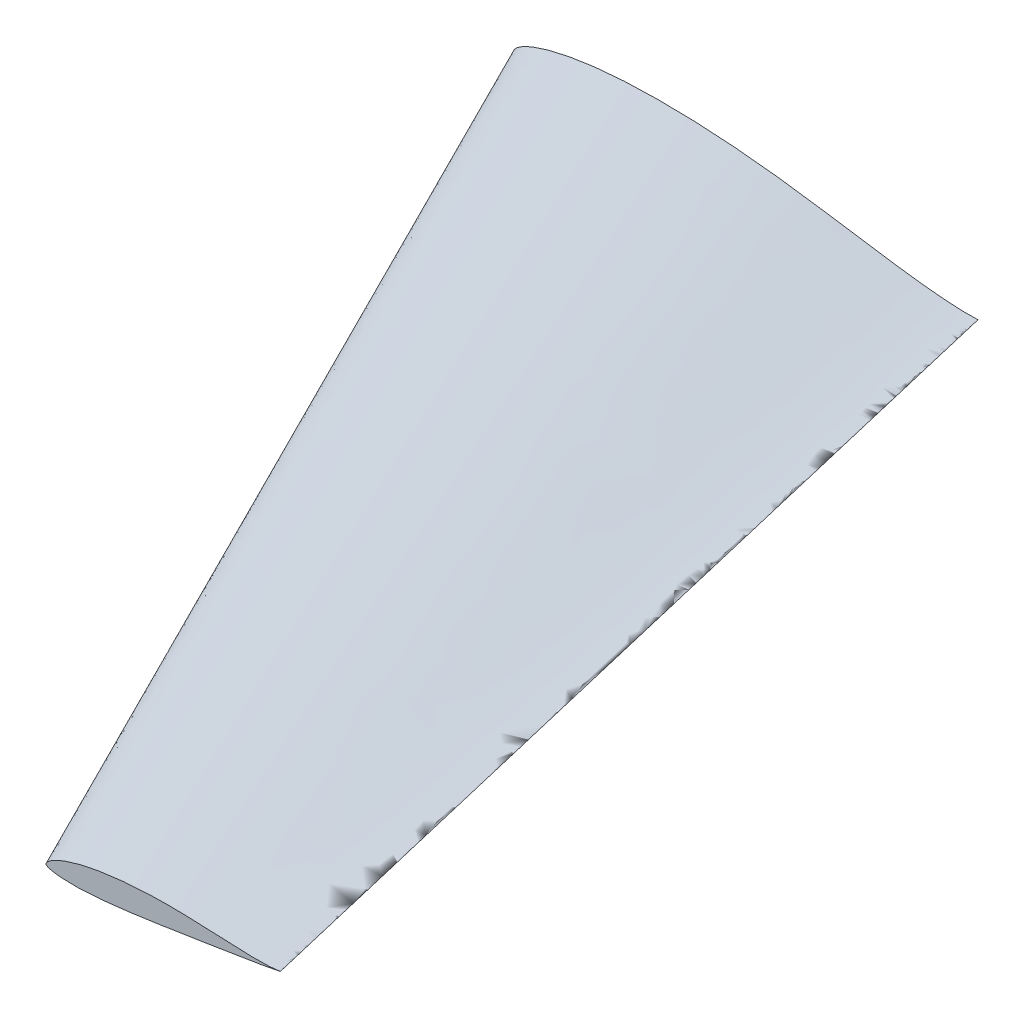
ISO-10303-21;
HEADER;
FILE_DESCRIPTION(('STEP AP214'),'2;1');
FILE_NAME('part.step','',(''),(''),'','','');
FILE_SCHEMA(('AUTOMOTIVE_DESIGN { 1 0 10303 214 1 1 1 1 }'));
ENDSEC;
DATA;
#1=APPLICATION_CONTEXT('core data for automotive mechanical design processes');
#2=APPLICATION_PROTOCOL_DEFINITION('international standard','automotive_design',2000,#1);
#3=PRODUCT_CONTEXT('',#1,'mechanical');
#4=PRODUCT('Part','Part','',(#3));
#5=PRODUCT_RELATED_PRODUCT_CATEGORY('part','',(#4));
#6=PRODUCT_DEFINITION_FORMATION('','',#4);
#7=PRODUCT_DEFINITION_CONTEXT('part definition',#1,'design');
#8=PRODUCT_DEFINITION('design','',#6,#7);
#9=PRODUCT_DEFINITION_SHAPE('','',#8);
#10=(LENGTH_UNIT() NAMED_UNIT(*) SI_UNIT(.MILLI.,.METRE.));
#11=(NAMED_UNIT(*) PLANE_ANGLE_UNIT() SI_UNIT($,.RADIAN.));
#12=(NAMED_UNIT(*) SI_UNIT($,.STERADIAN.) SOLID_ANGLE_UNIT());
#13=UNCERTAINTY_MEASURE_WITH_UNIT(LENGTH_MEASURE(1.E-05),#10,'distance_accuracy_value','');
#14=(GEOMETRIC_REPRESENTATION_CONTEXT(3) GLOBAL_UNCERTAINTY_ASSIGNED_CONTEXT((#13)) GLOBAL_UNIT_ASSIGNED_CONTEXT((#10,
#11,#12)) REPRESENTATION_CONTEXT('',''));
#15=CARTESIAN_POINT('',(0.,0.,0.));
#16=DIRECTION('',(0.,0.,1.));
#17=DIRECTION('',(1.,0.,0.));
#18=AXIS2_PLACEMENT_3D('',#15,#16,#17);
#19=CARTESIAN_POINT('',(-9.78695783442528,0.49823393795302,0.));
#20=DIRECTION('',(0.,0.,-1.));
#21=DIRECTION('',(-1.,0.,0.));
#22=AXIS2_PLACEMENT_3D('',#19,#20,#21);
#23=PLANE('',#22);
#24=CARTESIAN_POINT('',(90.,0.,0.));
#25=CARTESIAN_POINT('',(90.0028479732241,0.00436190831534167,0.));
#26=CARTESIAN_POINT('',(89.2649387295325,-0.0543533400763246,0.));
#27=CARTESIAN_POINT('',(88.514887996596,-0.0615638840488552,0.));
#28=CARTESIAN_POINT('',(86.6653433164652,-0.0586329476962221,0.));
#29=CARTESIAN_POINT('',(84.4109573345135,0.0582358636037683,0.));
#30=CARTESIAN_POINT('',(81.4935070777252,0.270036905184064,0.));
#31=CARTESIAN_POINT('',(78.1056942172872,0.612789431252755,0.));
#32=CARTESIAN_POINT('',(74.2771951068461,1.08266069879047,0.));
#33=CARTESIAN_POINT('',(70.1005403806538,1.66338395007754,0.));
#34=CARTESIAN_POINT('',(65.6465445280991,2.32975538816507,0.));
#35=CARTESIAN_POINT('',(60.9888926236065,3.05102840593136,0.));
#36=CARTESIAN_POINT('',(56.1914467901112,3.78805823784509,0.));
#37=CARTESIAN_POINT('',(51.3037241942696,4.48708375324335,0.));
#38=CARTESIAN_POINT('',(46.3662415790435,5.11200727767063,0.));
#39=CARTESIAN_POINT('',(41.4150516644569,5.64330132232687,0.));
#40=CARTESIAN_POINT('',(36.4868765536774,6.06530755085394,0.));
#41=CARTESIAN_POINT('',(31.6206738986552,6.37241206254763,0.));
#42=CARTESIAN_POINT('',(26.8570736911256,6.56012615506244,0.));
#43=CARTESIAN_POINT('',(22.2381814387463,6.6276932978474,0.));
#44=CARTESIAN_POINT('',(17.8052490073107,6.57472820798883,0.));
#45=CARTESIAN_POINT('',(13.5971667741359,6.39877136682722,0.));
#46=CARTESIAN_POINT('',(9.64878019510438,6.10268673119169,0.));
#47=CARTESIAN_POINT('',(5.99056477565375,5.69055599458238,0.));
#48=CARTESIAN_POINT('',(2.65049471641469,5.17334019745164,0.));
#49=CARTESIAN_POINT('',(-0.345511060532771,4.57232402848591,0.));
#50=CARTESIAN_POINT('',(-2.97184132988568,3.9056615609588,0.));
#51=CARTESIAN_POINT('',(-5.20483364709569,3.19083470138705,0.));
#52=CARTESIAN_POINT('',(-7.02723364049595,2.44858092349217,0.));
#53=CARTESIAN_POINT('',(-8.42407575539885,1.70379995957939,0.));
#54=CARTESIAN_POINT('',(-9.30415214487675,1.05807271911263,0.));
#55=CARTESIAN_POINT('',(-9.73190870920889,0.588394024753853,0.));
#56=CARTESIAN_POINT('',(-9.89451304901725,0.337921607753932,0.));
#57=CARTESIAN_POINT('',(-9.96744283596264,0.177503453896453,0.));
#58=CARTESIAN_POINT('',(-10.0005043293363,0.0496111666136701,0.));
#59=CARTESIAN_POINT('',(-10.0019459634289,-0.0526883332918314,0.));
#60=CARTESIAN_POINT('',(-9.95858819604196,-0.147711214185976,0.));
#61=CARTESIAN_POINT('',(-9.87280402291606,-0.259199923399735,0.));
#62=CARTESIAN_POINT('',(-9.73249805575398,-0.391764037586095,0.));
#63=CARTESIAN_POINT('',(-9.48098479016931,-0.578314241301843,0.));
#64=CARTESIAN_POINT('',(-8.88435040413067,-0.934364768846487,0.));
#65=CARTESIAN_POINT('',(-7.75475773137547,-1.38699070505707,0.));
#66=CARTESIAN_POINT('',(-6.02580881157916,-1.89158098156744,0.));
#67=CARTESIAN_POINT('',(-3.83468816005437,-2.36500321135282,0.));
#68=CARTESIAN_POINT('',(-1.20483156565626,-2.78626099343301,0.));
#69=CARTESIAN_POINT('',(1.8440238275189,-3.13726323832098,0.));
#70=CARTESIAN_POINT('',(5.28865817265512,-3.40559043391838,0.));
#71=CARTESIAN_POINT('',(9.1031687464859,-3.58879332015241,0.));
#72=CARTESIAN_POINT('',(13.2570613697289,-3.68420446782186,0.));
#73=CARTESIAN_POINT('',(17.7154364437978,-3.69657523874479,0.));
#74=CARTESIAN_POINT('',(22.438322930504,-3.63144007830993,0.));
#75=CARTESIAN_POINT('',(27.3805620485354,-3.50205287345196,0.));
#76=CARTESIAN_POINT('',(32.4910784953064,-3.31900625357672,0.));
#77=CARTESIAN_POINT('',(37.713660161153,-3.09862777847261,0.));
#78=CARTESIAN_POINT('',(42.9877215183725,-2.8511340038028,0.));
#79=CARTESIAN_POINT('',(48.2501895082865,-2.58881525452418,0.));
#80=CARTESIAN_POINT('',(53.4370683906385,-2.31845665950589,0.));
#81=CARTESIAN_POINT('',(58.484991185312,-2.04828907638093,0.));
#82=CARTESIAN_POINT('',(63.3322691931571,-1.78195378695929,0.));
#83=CARTESIAN_POINT('',(67.9198812409662,-1.52513332715702,0.));
#84=CARTESIAN_POINT('',(72.1921705090664,-1.27982857988553,0.));
#85=CARTESIAN_POINT('',(76.0953942892285,-1.05219143476493,0.));
#86=CARTESIAN_POINT('',(79.584825305705,-0.841582807054966,0.));
#87=CARTESIAN_POINT('',(82.6043649342058,-0.652449350261777,0.));
#88=CARTESIAN_POINT('',(85.1527418309688,-0.477848775542187,0.));
#89=CARTESIAN_POINT('',(87.1006176702134,-0.332406268363439,0.));
#90=CARTESIAN_POINT('',(88.6806179753043,-0.178618542930742,0.));
#91=CARTESIAN_POINT('',(89.3463696048351,-0.0853048922423342,0.));
#92=CARTESIAN_POINT('',(89.9973034823996,-0.00412994140672754,0.));
#93=CARTESIAN_POINT('',(90.,0.,0.));
#94=B_SPLINE_CURVE_WITH_KNOTS('',3,(#24,#25,#26,#27,#28,#29,#30,#31,#32,#33,#34,#35,#36,#37,#38,
#39,#40,#41,#42,#43,#44,#45,#46,#47,#48,#49,#50,#51,#52,#53,#54,#55,#56,#57,#58,#59,#60,#61,#62,
#63,#64,#65,#66,#67,#68,#69,#70,#71,#72,#73,#74,#75,#76,#77,#78,#79,#80,#81,#82,#83,#84,#85,#86,
#87,#88,#89,#90,#91,#92,#93),.UNSPECIFIED.,.T.,.F.,(4,1,1,1,1,1,1,1,1,1,1,1,1,1,1,1,1,1,1,1,1,1,
1,1,1,1,1,1,1,1,1,1,1,1,1,1,1,1,1,1,1,1,1,1,1,1,1,1,1,1,1,1,1,1,1,1,1,1,1,1,1,1,1,1,1,1,1,4),
(0.,0.00166889444227927,0.00674684261594813,0.0151872129386611,0.0267420621956626,
0.0411547244136289,0.0581287371473307,0.0772832861456259,0.0982270614239506,0.120580114075382,
0.143965618975972,0.168018430342604,0.192451149867517,0.217074812267772,0.24170960523573,
0.266181697194069,0.290309902402822,0.313902919762404,0.336766570965943,0.358704118492275,
0.379539615222553,0.399121985975392,0.417322023259521,0.434037060269163,0.449154223102326,
0.462553001072433,0.474138703720767,0.483847820074002,0.491647295738643,0.497539457803786,
0.499898001147866,0.501005480813929,0.501950633598751,0.50249156911681,0.5029561863067,
0.50343127816909,0.504003663511862,0.505035338611572,0.506275727387693,0.508636079320926,
0.515300989494995,0.524212720450063,0.535295542817935,0.548466714983409,0.563638125804605,
0.580726427110563,0.599618641918251,0.6201796202389,0.642246244460865,0.665632647569848,
0.69011801784579,0.71545212958592,0.741354375785369,0.767519886202747,0.793633569946153,
0.819375078028979,0.844428817604615,0.868487752174835,0.89125912064447,0.912467268250436,
0.931850462152931,0.949165437969833,0.964196020707947,0.976755393856121,0.986688030230315,
0.993909500787702,0.998419857603063,1.),.UNSPECIFIED.);
#95=CARTESIAN_POINT('',(90.,0.,0.));
#96=VERTEX_POINT('',#95);
#97=EDGE_CURVE('E65',#96,#96,#94,.T.);
#98=ORIENTED_EDGE('',*,*,#97,.F.);
#99=EDGE_LOOP('',(#98));
#100=FACE_BOUND('',#99,.T.);
#101=ADVANCED_FACE('F55',(#100),#23,.T.);
#102=CARTESIAN_POINT('',(89.4478507920486,-1.55699772792481,200.));
#103=DIRECTION('',(0.,0.,-1.));
#104=DIRECTION('',(-1.,0.,0.));
#105=AXIS2_PLACEMENT_3D('',#102,#103,#104);
#106=PLANE('',#105);
#107=CARTESIAN_POINT('',(139.809734904587,3.40079512692394,200.));
#108=CARTESIAN_POINT('',(139.81094381534,3.40314409023377,200.));
#109=CARTESIAN_POINT('',(139.441782818446,3.33500552387382,200.));
#110=CARTESIAN_POINT('',(139.063808579581,3.29221383615629,200.));
#111=CARTESIAN_POINT('',(138.130683453446,3.1971416269716,200.));
#112=CARTESIAN_POINT('',(136.987395019643,3.13840980060758,200.));
#113=CARTESIAN_POINT('',(135.504679124419,3.09295141602217,200.));
#114=CARTESIAN_POINT('',(133.777860636769,3.08899527806902,200.));
#115=CARTESIAN_POINT('',(131.822109379251,3.12615720001543,200.));
#116=CARTESIAN_POINT('',(129.684950058738,3.20106200703636,200.));
#117=CARTESIAN_POINT('',(127.403419568065,3.30469274827797,200.));
#118=CARTESIAN_POINT('',(125.016292167046,3.42538634569535,200.));
#119=CARTESIAN_POINT('',(122.55782549464,3.54673062794175,200.));
#120=CARTESIAN_POINT('',(120.055804123976,3.64419159966355,200.));
#121=CARTESIAN_POINT('',(117.532550438986,3.70167545918044,200.));
#122=CARTESIAN_POINT('',(115.007270017844,3.71121392730407,200.));
#123=CARTESIAN_POINT('',(112.499304118901,3.66682539800103,200.));
#124=CARTESIAN_POINT('',(110.028597342342,3.56771171514696,200.));
#125=CARTESIAN_POINT('',(107.61587913436,3.41372961040987,200.));
#126=CARTESIAN_POINT('',(105.282428412341,3.20669547306353,200.));
#127=CARTESIAN_POINT('',(103.049074108182,2.94856839993833,200.));
#128=CARTESIAN_POINT('',(100.935562220185,2.64013789869412,200.));
#129=CARTESIAN_POINT('',(98.9593204549568,2.28466766126109,200.));
#130=CARTESIAN_POINT('',(97.1355086013343,1.88580752472562,200.));
#131=CARTESIAN_POINT('',(95.4776655880287,1.45054692448007,200.));
#132=CARTESIAN_POINT('',(93.9977546733729,0.990975598494021,200.));
#133=CARTESIAN_POINT('',(92.7077473288051,0.51758803522847,200.));
#134=CARTESIAN_POINT('',(91.618667084366,0.0404379287444312,200.));
#135=CARTESIAN_POINT('',(90.7381350756398,-0.429113326824826,200.));
#136=CARTESIAN_POINT('',(90.0724006025749,-0.87772423680809,200.));
#137=CARTESIAN_POINT('',(89.6621691828555,-1.24939272845038,200.));
#138=CARTESIAN_POINT('',(89.4709128369045,-1.50864427171329,200.));
#139=CARTESIAN_POINT('',(89.4019650371235,-1.64347926316105,200.));
#140=CARTESIAN_POINT('',(89.3735510288808,-1.72820664895822,200.));
#141=CARTESIAN_POINT('',(89.3635499914912,-1.79444568045424,200.));
#142=CARTESIAN_POINT('',(89.3681630625183,-1.84612422247599,200.));
#143=CARTESIAN_POINT('',(89.3949945912842,-1.89179355849885,200.));
#144=CARTESIAN_POINT('',(89.4440869721979,-1.94355404819128,200.));
#145=CARTESIAN_POINT('',(89.5217821541501,-2.0030995077096,200.));
#146=CARTESIAN_POINT('',(89.658392215964,-2.0840720664084,200.));
#147=CARTESIAN_POINT('',(89.977941224085,-2.23253010011508,200.));
#148=CARTESIAN_POINT('',(90.5713736646362,-2.40188229451876,200.));
#149=CARTESIAN_POINT('',(91.4698540821155,-2.56615920352711,200.));
#150=CARTESIAN_POINT('',(92.5998423139609,-2.69058743488497,200.));
#151=CARTESIAN_POINT('',(93.9484205028318,-2.76579910693952,200.));
#152=CARTESIAN_POINT('',(95.5046881755971,-2.78369879607918,200.));
#153=CARTESIAN_POINT('',(97.2562841374804,-2.73923381723781,200.));
#154=CARTESIAN_POINT('',(99.1900143322822,-2.63252086613605,200.));
#155=CARTESIAN_POINT('',(101.290357231049,-2.46380627172194,200.));
#156=CARTESIAN_POINT('',(103.539956342858,-2.23730862243349,200.));
#157=CARTESIAN_POINT('',(105.91893785207,-1.95790626154138,200.));
#158=CARTESIAN_POINT('',(108.405214045485,-1.63464228915692,200.));
#159=CARTESIAN_POINT('',(110.97357379489,-1.27552623480012,200.));
#160=CARTESIAN_POINT('',(113.596514172105,-0.891728672120713,200.));
#161=CARTESIAN_POINT('',(116.244007141709,-0.491565883056084,200.));
#162=CARTESIAN_POINT('',(118.884878130289,-0.0845300831407839,200.));
#163=CARTESIAN_POINT('',(121.487199748573,0.322615350715834,200.));
#164=CARTESIAN_POINT('',(124.019437245419,0.722410590507122,200.));
#165=CARTESIAN_POINT('',(126.450662863796,1.10979855388934,200.));
#166=CARTESIAN_POINT('',(128.751400994237,1.47883173301247,200.));
#167=CARTESIAN_POINT('',(130.893680928467,1.82559539612381,200.));
#168=CARTESIAN_POINT('',(132.850714192483,2.14418082622608,200.));
#169=CARTESIAN_POINT('',(134.599905492438,2.43257552786798,200.));
#170=CARTESIAN_POINT('',(136.113188934146,2.68560797764205,200.));
#171=CARTESIAN_POINT('',(137.3895608052,2.90671373076521,200.));
#172=CARTESIAN_POINT('',(138.364542003068,3.08176358407505,200.));
#173=CARTESIAN_POINT('',(139.153518851504,3.24181905843934,200.));
#174=CARTESIAN_POINT('',(139.484475017613,3.32364341409874,200.));
#175=CARTESIAN_POINT('',(139.808590283881,3.39857108181918,200.));
#176=CARTESIAN_POINT('',(139.809734904587,3.40079512692394,200.));
#177=B_SPLINE_CURVE_WITH_KNOTS('',3,(#107,#108,#109,#110,#111,#112,#113,#114,#115,#116,#117,
#118,#119,#120,#121,#122,#123,#124,#125,#126,#127,#128,#129,#130,#131,#132,#133,#134,#135,#136,
#137,#138,#139,#140,#141,#142,#143,#144,#145,#146,#147,#148,#149,#150,#151,#152,#153,#154,#155,
#156,#157,#158,#159,#160,#161,#162,#163,#164,#165,#166,#167,#168,#169,#170,#171,#172,#173,#174,
#175,#176),.UNSPECIFIED.,.T.,.F.,(4,1,1,1,1,1,1,1,1,1,1,1,1,1,1,1,1,1,1,1,1,1,1,1,1,1,1,1,1,1,1,
1,1,1,1,1,1,1,1,1,1,1,1,1,1,1,1,1,1,1,1,1,1,1,1,1,1,1,1,1,1,1,1,1,1,1,1,4),(0.,
0.00166889444227934,0.00674684261594817,0.0151872129386612,0.0267420621956626,
0.0411547244136289,0.0581287371473307,0.0772832861456259,0.0982270614239506,0.120580114075382,
0.143965618975972,0.168018430342604,0.192451149867517,0.217074812267772,0.24170960523573,
0.266181697194069,0.290309902402821,0.313902919762404,0.336766570965943,0.358704118492275,
0.379539615222553,0.399121985975392,0.417322023259521,0.434037060269163,0.449154223102326,
0.462553001072433,0.474138703720767,0.483847820074002,0.491647295738643,0.497539457803786,
0.499898001147866,0.501005480813929,0.501950633598751,0.50249156911681,0.5029561863067,
0.50343127816909,0.504003663511862,0.505035338611572,0.506275727387693,0.508636079320926,
0.515300989494995,0.524212720450063,0.535295542817935,0.548466714983409,0.563638125804605,
0.580726427110564,0.599618641918251,0.6201796202389,0.642246244460865,0.665632647569848,
0.69011801784579,0.71545212958592,0.741354375785369,0.767519886202747,0.793633569946153,
0.819375078028979,0.844428817604615,0.868487752174835,0.89125912064447,0.912467268250436,
0.931850462152931,0.949165437969833,0.964196020707947,0.976755393856121,0.986688030230315,
0.993909500787702,0.998419857603063,1.),.UNSPECIFIED.);
#178=CARTESIAN_POINT('',(139.809734904587,3.40079512692394,200.));
#179=VERTEX_POINT('',#178);
#180=EDGE_CURVE('E13',#179,#179,#177,.T.);
#181=ORIENTED_EDGE('',*,*,#180,.T.);
#182=EDGE_LOOP('',(#181));
#183=FACE_BOUND('',#182,.T.);
#184=ADVANCED_FACE('F112',(#183),#106,.F.);
#185=CARTESIAN_POINT('',(89.3795236442854,-1.86386383257901,200.));
#186=CARTESIAN_POINT('',(-9.99906693888036,-0.0229998705746616,0.));
#187=CARTESIAN_POINT('',(89.3763233733468,-1.85767494279112,200.));
#188=CARTESIAN_POINT('',(-10.0002117706725,-0.00934100860358975,0.));
#189=CARTESIAN_POINT('',(89.3719053086546,-1.84734669051356,200.));
#190=CARTESIAN_POINT('',(-10.0002762273779,0.0129592141390314,0.));
#191=CARTESIAN_POINT('',(89.3662946889145,-1.82519351856294,200.));
#192=CARTESIAN_POINT('',(-9.99602237995235,0.0582621689404072,0.));
#193=CARTESIAN_POINT('',(89.3649008783731,-1.80204272522801,200.));
#194=CARTESIAN_POINT('',(-9.98686691160564,0.102365001006271,0.));
#195=CARTESIAN_POINT('',(89.3669620871452,-1.77184663370644,200.));
#196=CARTESIAN_POINT('',(-9.96968431619787,0.159374659109389,0.));
#197=CARTESIAN_POINT('',(89.3737409490014,-1.73312989907346,200.));
#198=CARTESIAN_POINT('',(-9.94267075661567,0.231992729163727,0.));
#199=CARTESIAN_POINT('',(89.3861068311903,-1.6907666546715,200.));
#200=CARTESIAN_POINT('',(-9.90467110846716,0.310404205069544,0.));
#201=CARTESIAN_POINT('',(89.4072296461467,-1.6358797144641,200.));
#202=CARTESIAN_POINT('',(-9.847139045289,0.410895559314893,0.));
#203=CARTESIAN_POINT('',(89.4287335682448,-1.59113046194804,200.));
#204=CARTESIAN_POINT('',(-9.79252500624743,0.492150532592056,0.));
#205=CARTESIAN_POINT('',(89.4809210618758,-1.49756102528021,200.));
#206=CARTESIAN_POINT('',(-9.66574433060588,0.661042819761453,0.));
#207=CARTESIAN_POINT('',(89.5347999532551,-1.42204409420731,200.));
#208=CARTESIAN_POINT('',(-9.54138001153238,0.795373982841501,0.));
#209=CARTESIAN_POINT('',(89.7063859430853,-1.21169203241644,200.));
#210=CARTESIAN_POINT('',(-9.15618222698426,1.16664080240083,0.));
#211=CARTESIAN_POINT('',(89.8643607168171,-1.06620777762003,200.));
#212=CARTESIAN_POINT('',(-8.81370199956854,1.41607184233257,0.));
#213=CARTESIAN_POINT('',(90.2212657336637,-0.778609535693583,200.));
#214=CARTESIAN_POINT('',(-8.05206305596674,1.9021530690073,0.));
#215=CARTESIAN_POINT('',(90.4522443708831,-0.621763241176181,200.));
#216=CARTESIAN_POINT('',(-7.56573303840624,2.16021241281561,0.));
#217=CARTESIAN_POINT('',(90.953957290135,-0.314804901154458,200.));
#218=CARTESIAN_POINT('',(-6.51739412227948,2.65623583453626,0.));
#219=CARTESIAN_POINT('',(91.2577378117499,-0.15203070550066,200.));
#220=CARTESIAN_POINT('',(-5.88766220854125,2.91182197702996,0.));
#221=CARTESIAN_POINT('',(91.9023167300388,0.164162822122861,200.));
#222=CARTESIAN_POINT('',(-4.55803851670946,3.39788715216215,0.));
#223=CARTESIAN_POINT('',(92.2764672844959,0.328634723369815,200.));
#224=CARTESIAN_POINT('',(-3.79027703915707,3.64295887881456,0.));
#225=CARTESIAN_POINT('',(93.0587106293954,0.645961635717942,200.));
#226=CARTESIAN_POINT('',(-2.1908036985209,4.10391860449714,0.));
#227=CARTESIAN_POINT('',(93.5005211255714,0.808508282661432,200.));
#228=CARTESIAN_POINT('',(-1.29090221144284,4.33177018346403,0.));
#229=CARTESIAN_POINT('',(94.4139999662178,1.11990180902707,200.));
#230=CARTESIAN_POINT('',(0.564518463378722,4.75488123926147,0.));
#231=CARTESIAN_POINT('',(94.9196416461354,1.2772582485414,200.));
#232=CARTESIAN_POINT('',(1.58845615180146,4.95978476968611,0.));
#233=CARTESIAN_POINT('',(95.956122544258,1.57587797014352,200.));
#234=CARTESIAN_POINT('',(3.68239103930172,5.33313118079403,0.));
#235=CARTESIAN_POINT('',(96.5211745211739,1.72451636607197,200.));
#236=CARTESIAN_POINT('',(4.82101994324462,5.50897948121616,0.));
#237=CARTESIAN_POINT('',(97.6721954322078,2.00291637772223,200.));
#238=CARTESIAN_POINT('',(7.13540892698388,5.81953294352909,0.));
#239=CARTESIAN_POINT('',(98.2925975157483,2.13885810199333,200.));
#240=CARTESIAN_POINT('',(8.37997440305822,5.95932102677283,0.));
#241=CARTESIAN_POINT('',(99.5500332590176,2.39068730800324,200.));
#242=CARTESIAN_POINT('',(10.8976020871013,6.19633434331488,0.));
#243=CARTESIAN_POINT('',(100.221651591269,2.51172548214069,200.));
#244=CARTESIAN_POINT('',(12.2395565911301,6.29659062878356,0.));
#245=CARTESIAN_POINT('',(101.57628119031,2.7334359144631,200.));
#246=CARTESIAN_POINT('',(14.9416381172407,6.4549891205346,0.));
#247=CARTESIAN_POINT('',(102.293984773646,2.83837617284105,200.));
#248=CARTESIAN_POINT('',(16.3706859599665,6.51440381713107,0.));
#249=CARTESIAN_POINT('',(103.73490681966,3.02765350669456,200.));
#250=CARTESIAN_POINT('',(19.2353887293128,6.59181565068229,0.));
#251=CARTESIAN_POINT('',(104.492900178207,3.11544321996276,200.));
#252=CARTESIAN_POINT('',(20.739957425836,6.60948891710799,0.));
#253=CARTESIAN_POINT('',(106.007700841007,3.27088395933763,200.));
#254=CARTESIAN_POINT('',(23.7426609241013,6.60568512475099,0.));
#255=CARTESIAN_POINT('',(106.799339782875,3.34128260364482,200.));
#256=CARTESIAN_POINT('',(25.3096755340133,6.58247817470174,0.));
#257=CARTESIAN_POINT('',(108.374166022174,3.46197541101153,200.));
#258=CARTESIAN_POINT('',(28.4230327751635,6.49841808226681,0.));
#259=CARTESIAN_POINT('',(109.192229221866,3.51433385978865,200.));
#260=CARTESIAN_POINT('',(30.0382009462056,6.4344984187936,0.));
#261=CARTESIAN_POINT('',(110.812766370783,3.59902779462269,200.));
#262=CARTESIAN_POINT('',(33.2338845161121,6.27060285030246,0.));
#263=CARTESIAN_POINT('',(111.650147109995,3.63276102448955,200.));
#264=CARTESIAN_POINT('',(34.883150280518,6.16625876832643,0.));
#265=CARTESIAN_POINT('',(113.302299861635,3.68090445720915,200.));
#266=CARTESIAN_POINT('',(38.1334056965444,5.92431305733008,0.));
#267=CARTESIAN_POINT('',(114.151997154802,3.69607643896771,200.));
#268=CARTESIAN_POINT('',(39.8030517912397,5.78108896493045,0.));
#269=CARTESIAN_POINT('',(115.822151410169,3.70800878159842,200.));
#270=CARTESIAN_POINT('',(43.081246948583,5.46450801264538,0.));
#271=CARTESIAN_POINT('',(116.677541128859,3.70490499320833,200.));
#272=CARTESIAN_POINT('',(44.7583421286694,5.28432259266758,0.));
#273=CARTESIAN_POINT('',(118.352781490059,3.68287708603299,200.));
#274=CARTESIAN_POINT('',(48.0396131429777,4.90021326503241,0.));
#275=CARTESIAN_POINT('',(119.207562629939,3.66351593283293,200.));
#276=CARTESIAN_POINT('',(49.7122134526837,4.68832658288223,0.));
#277=CARTESIAN_POINT('',(120.87522527089,3.61217769815207,200.));
#278=CARTESIAN_POINT('',(52.9726738935114,4.24839622529755,0.));
#279=CARTESIAN_POINT('',(121.723027727533,3.57924841636971,200.));
#280=CARTESIAN_POINT('',(54.6288399590964,4.01141389577995,0.));
#281=CARTESIAN_POINT('',(123.370321886489,3.50656675444491,200.));
#282=CARTESIAN_POINT('',(57.8450459918858,3.53401640307806,0.));
#283=CARTESIAN_POINT('',(124.204721588554,3.46544361002387,200.));
#284=CARTESIAN_POINT('',(59.4732835960852,3.28385653237025,0.));
#285=CARTESIAN_POINT('',(125.815728233875,3.38495971725706,200.));
#286=CARTESIAN_POINT('',(62.6167920372083,2.79893573203789,0.));
#287=CARTESIAN_POINT('',(126.627231021392,3.34393698297281,200.));
#288=CARTESIAN_POINT('',(64.2001676927692,2.55379970068353,0.));
#289=CARTESIAN_POINT('',(128.18028688687,3.26943585068001,200.));
#290=CARTESIAN_POINT('',(67.2312731301753,2.09266089762165,0.));
#291=CARTESIAN_POINT('',(128.956726686153,3.23413907008635,200.));
#292=CARTESIAN_POINT('',(68.747054884251,1.86600768856564,0.));
#293=CARTESIAN_POINT('',(130.42662683847,3.17512646922876,200.));
#294=CARTESIAN_POINT('',(71.6182193130842,1.45236544320316,0.));
#295=CARTESIAN_POINT('',(131.15498229637,3.14953918418571,200.));
#296=CARTESIAN_POINT('',(73.0416845218573,1.25464390750255,0.));
#297=CARTESIAN_POINT('',(132.516513353948,3.11305336528817,200.));
#298=CARTESIAN_POINT('',(75.7049446025692,0.907433162899922,0.));
#299=CARTESIAN_POINT('',(133.184544369866,3.10026909048021,200.));
#300=CARTESIAN_POINT('',(77.0126607531964,0.747202428219478,0.));
#301=CARTESIAN_POINT('',(134.409053905744,3.09056023653445,200.));
#302=CARTESIAN_POINT('',(79.412428689642,0.480584212206883,0.));
#303=CARTESIAN_POINT('',(135.000631012635,3.09179664273273,200.));
#304=CARTESIAN_POINT('',(80.5731708952185,0.363513487614518,0.));
#305=CARTESIAN_POINT('',(136.067346878554,3.11035707338366,200.));
#306=CARTESIAN_POINT('',(82.6698238738234,0.184638663324656,0.));
#307=CARTESIAN_POINT('',(136.576680319435,3.12581775458105,200.));
#308=CARTESIAN_POINT('',(83.6716547328131,0.112170469265366,0.));
#309=CARTESIAN_POINT('',(137.443493115754,3.16195138723668,200.));
#310=CARTESIAN_POINT('',(85.3775453256097,0.00812732387692788,0.));
#311=CARTESIAN_POINT('',(137.838932816901,3.18215411619083,200.));
#312=CARTESIAN_POINT('',(86.1585589851269,-0.0316110567490993,0.));
#313=CARTESIAN_POINT('',(138.53599663715,3.23868790689984,200.));
#314=CARTESIAN_POINT('',(87.5427791780192,-0.060023402704614,0.));
#315=CARTESIAN_POINT('',(138.862172930578,3.27167002475931,200.));
#316=CARTESIAN_POINT('',(88.1850886127892,-0.0609191183426582,0.));
#317=CARTESIAN_POINT('',(139.255264871836,3.31394667220055,200.));
#318=CARTESIAN_POINT('',(88.9485251626585,-0.0573951528994631,0.));
#319=CARTESIAN_POINT('',(139.391785573502,3.32934517384886,200.));
#320=CARTESIAN_POINT('',(89.2324811186382,-0.0525762022338585,0.));
#321=CARTESIAN_POINT('',(139.685438943631,3.38015861549454,200.));
#322=CARTESIAN_POINT('',(89.8575078434418,-0.00720276836326082,0.));
#323=CARTESIAN_POINT('',(139.792339112901,3.39971009324483,200.));
#324=CARTESIAN_POINT('',(90.0317612601899,0.00564834350562425,0.));
#325=CARTESIAN_POINT('',(139.82309067665,3.40243559565485,200.));
#326=CARTESIAN_POINT('',(89.9609629336326,-0.00866180303074541,0.));
#327=CARTESIAN_POINT('',(139.74259539302,3.38331464755549,200.));
#328=CARTESIAN_POINT('',(89.7618375618508,-0.0335766773039733,0.));
#329=CARTESIAN_POINT('',(139.469775403547,3.31977770192703,200.));
#330=CARTESIAN_POINT('',(89.2503392765938,-0.0987647774420485,0.));
#331=CARTESIAN_POINT('',(139.341509265738,3.28829710021667,200.));
#332=CARTESIAN_POINT('',(89.0045426095111,-0.132777240671198,0.));
#333=CARTESIAN_POINT('',(139.011493827838,3.21324896768974,200.));
#334=CARTESIAN_POINT('',(88.3268773661848,-0.21304952594661,0.));
#335=CARTESIAN_POINT('',(138.73865188275,3.15765723593015,200.));
#336=CARTESIAN_POINT('',(87.7765192652908,-0.266395360746314,0.));
#337=CARTESIAN_POINT('',(138.150633894976,3.0435310926888,200.));
#338=CARTESIAN_POINT('',(86.6049217990483,-0.369418509517557,0.));
#339=CARTESIAN_POINT('',(137.812825534412,2.98270743087116,200.));
#340=CARTESIAN_POINT('',(85.9311280840419,-0.419663930292494,0.));
#341=CARTESIAN_POINT('',(137.074589159413,2.85219161645563,200.));
#342=CARTESIAN_POINT('',(84.4550659868938,-0.525649634001626,0.));
#343=CARTESIAN_POINT('',(136.636036819294,2.77618085693868,200.));
#344=CARTESIAN_POINT('',(83.5791001789422,-0.585603092569972,0.));
#345=CARTESIAN_POINT('',(135.712918872438,2.618718598222,200.));
#346=CARTESIAN_POINT('',(81.7369716548602,-0.706779847458551,0.));
#347=CARTESIAN_POINT('',(135.194873916067,2.53205875329684,200.));
#348=CARTESIAN_POINT('',(80.7033725004974,-0.771496047530978,0.));
#349=CARTESIAN_POINT('',(134.114625281176,2.35258044504898,200.));
#350=CARTESIAN_POINT('',(78.5479809265349,-0.904162743673487,0.));
#351=CARTESIAN_POINT('',(133.517648473369,2.25414039037205,200.));
#352=CARTESIAN_POINT('',(77.3570480656373,-0.976020420131361,0.));
#353=CARTESIAN_POINT('',(132.288514367239,2.0526731937056,200.));
#354=CARTESIAN_POINT('',(74.9053443608608,-1.12159549241118,0.));
#355=CARTESIAN_POINT('',(131.62193455227,1.94414779798068,200.));
#356=CARTESIAN_POINT('',(73.5758811428632,-1.19912011819151,0.));
#357=CARTESIAN_POINT('',(130.261328987196,1.72324434244201,200.));
#358=CARTESIAN_POINT('',(70.8623144270273,-1.35618577146144,0.));
#359=CARTESIAN_POINT('',(129.532792271185,1.60531291653486,200.));
#360=CARTESIAN_POINT('',(69.409409016556,-1.43959202993959,0.));
#361=CARTESIAN_POINT('',(128.057236811007,1.36749824609892,200.));
#362=CARTESIAN_POINT('',(66.4669580294736,-1.60646984893443,0.));
#363=CARTESIAN_POINT('',(127.275720019804,1.24213585086877,200.));
#364=CARTESIAN_POINT('',(64.9086310412564,-1.69369528814033,0.));
#365=CARTESIAN_POINT('',(125.703500217695,0.99075308672516,200.));
#366=CARTESIAN_POINT('',(61.7738240570678,-1.86758306914536,0.));
#367=CARTESIAN_POINT('',(124.878292178411,0.859259289705356,200.));
#368=CARTESIAN_POINT('',(60.1285550663595,-1.95796668620764,0.));
#369=CARTESIAN_POINT('',(123.228552920024,0.597552688849005,200.));
#370=CARTESIAN_POINT('',(56.839604818541,-2.13635105278167,0.));
#371=CARTESIAN_POINT('',(122.369510227914,0.461916474760411,200.));
#372=CARTESIAN_POINT('',(55.1271311719916,-2.22798756180233,0.));
#373=CARTESIAN_POINT('',(120.662480277901,0.193592548977407,200.));
#374=CARTESIAN_POINT('',(51.7244666783361,-2.40772355839944,0.));
#375=CARTESIAN_POINT('',(119.779976398635,0.0555122430073351,200.));
#376=CARTESIAN_POINT('',(49.9654792655636,-2.49938198551806,0.));
#377=CARTESIAN_POINT('',(118.036587214692,-0.215262985406503,200.));
#378=CARTESIAN_POINT('',(46.4909997647905,-2.67650575528202,0.));
#379=CARTESIAN_POINT('',(117.141175336532,-0.353285908222869,200.));
#380=CARTESIAN_POINT('',(44.706705254214,-2.76541375863941,0.));
#381=CARTESIAN_POINT('',(115.382733881066,-0.621728060401309,200.));
#382=CARTESIAN_POINT('',(41.2031743348399,-2.93487673802873,0.));
#383=CARTESIAN_POINT('',(114.485167812147,-0.757410612282831,200.));
#384=CARTESIAN_POINT('',(39.415128481256,-3.01872841819059,0.));
#385=CARTESIAN_POINT('',(112.732876449053,-1.01807108570229,200.));
#386=CARTESIAN_POINT('',(35.9252367994381,-3.17409428881418,0.));
#387=CARTESIAN_POINT('',(111.843600894398,-1.14822090862613,200.));
#388=CARTESIAN_POINT('',(34.1545738291632,-3.24873637597939,0.));
#389=CARTESIAN_POINT('',(110.118071817713,-1.39510765265348,200.));
#390=CARTESIAN_POINT('',(30.7199680318278,-3.38244324417095,0.));
#391=CARTESIAN_POINT('',(109.247251605283,-1.51690597664655,200.));
#392=CARTESIAN_POINT('',(28.9871977552551,-3.44439296593911,0.));
#393=CARTESIAN_POINT('',(107.567885593646,-1.7434548338543,200.));
#394=CARTESIAN_POINT('',(25.6472627416101,-3.54743043353138,0.));
#395=CARTESIAN_POINT('',(106.724753487483,-1.85313465008359,200.));
#396=CARTESIAN_POINT('',(23.9712601169108,-3.59116045926917,0.));
#397=CARTESIAN_POINT('',(105.109181680038,-2.05293709202091,200.));
#398=CARTESIAN_POINT('',(20.7618831564352,-3.65456050984067,0.));
#399=CARTESIAN_POINT('',(104.302127049707,-2.14779456186945,200.));
#400=CARTESIAN_POINT('',(19.1596544506908,-3.67645888650892,0.));
#401=CARTESIAN_POINT('',(102.766167636235,-2.31512085088036,200.));
#402=CARTESIAN_POINT('',(16.113029455543,-3.69212899780551,0.));
#403=CARTESIAN_POINT('',(102.002613246101,-2.39209379981799,200.));
#404=CARTESIAN_POINT('',(14.5997589046226,-3.68768638137712,0.));
#405=CARTESIAN_POINT('',(100.560189268687,-2.52234294333165,200.));
#406=CARTESIAN_POINT('',(11.7441374368644,-3.64945397668893,0.));
#407=CARTESIAN_POINT('',(99.8466205209199,-2.57977755128454,200.));
#408=CARTESIAN_POINT('',(10.33288686099,-3.61673430456116,0.));
#409=CARTESIAN_POINT('',(98.510072680755,-2.66990118756178,200.));
#410=CARTESIAN_POINT('',(7.69310541231818,-3.52107095640683,0.));
#411=CARTESIAN_POINT('',(97.852336224283,-2.70634066732266,200.));
#412=CARTESIAN_POINT('',(6.39564569331479,-3.45839113227726,0.));
#413=CARTESIAN_POINT('',(96.6326375587791,-2.75489748505196,200.));
#414=CARTESIAN_POINT('',(3.99353541372219,-3.30470406310531,0.));
#415=CARTESIAN_POINT('',(96.0358463426348,-2.77021512908479,200.));
#416=CARTESIAN_POINT('',(2.81993295659226,-3.21282482584959,0.));
#417=CARTESIAN_POINT('',(94.9426094477599,-2.77702743575997,200.));
#418=CARTESIAN_POINT('',(0.674413341635585,-3.00261076936213,0.));
#419=CARTESIAN_POINT('',(94.4112562061792,-2.77112249401337,200.));
#420=CARTESIAN_POINT('',(-0.366479707600212,-2.88221772209982,0.));
#421=CARTESIAN_POINT('',(93.4527395803423,-2.73790863338696,200.));
#422=CARTESIAN_POINT('',(-2.23951578805704,-2.62052238182568,0.));
#423=CARTESIAN_POINT('',(92.9905700474581,-2.71237874546445,200.));
#424=CARTESIAN_POINT('',(-3.14065385547229,-2.47547627191316,0.));
#425=CARTESIAN_POINT('',(92.1742791595657,-2.64342902961638,200.));
#426=CARTESIAN_POINT('',(-4.72731622564098,-2.17213844651892,0.));
#427=CARTESIAN_POINT('',(91.7850702347562,-2.60086911223515,200.));
#428=CARTESIAN_POINT('',(-5.48174018781254,-2.00817988371521,0.));
#429=CARTESIAN_POINT('',(91.1193164619629,-2.5016775569747,200.));
#430=CARTESIAN_POINT('',(-6.7666157330335,-1.67537796651163,0.));
#431=CARTESIAN_POINT('',(90.8074547366603,-2.44504702914515,200.));
#432=CARTESIAN_POINT('',(-7.36624146416257,-1.49899400436783,0.));
#433=CARTESIAN_POINT('',(90.2991287557763,-2.32366133150938,200.));
#434=CARTESIAN_POINT('',(-8.33739233108376,-1.1535299740146,0.));
#435=CARTESIAN_POINT('',(90.0672811547597,-2.25802569535685,200.));
#436=CARTESIAN_POINT('',(-8.77725051211175,-0.974272217656533,0.));
#437=CARTESIAN_POINT('',(89.7918434579253,-2.14546847337218,200.));
#438=CARTESIAN_POINT('',(-9.29147350608377,-0.691407945341137,0.));
#439=CARTESIAN_POINT('',(89.7075872277372,-2.10692738603207,200.));
#440=CARTESIAN_POINT('',(-9.44744243172788,-0.596324367393556,0.));
#441=CARTESIAN_POINT('',(89.6090843628389,-2.05425065206099,200.));
#442=CARTESIAN_POINT('',(-9.62759942685122,-0.469568524541572,0.));
#443=CARTESIAN_POINT('',(89.5622335481235,-2.02707616674529,200.));
#444=CARTESIAN_POINT('',(-9.71223157893367,-0.404426352625212,0.));
#445=CARTESIAN_POINT('',(89.5069231003425,-1.99066020397235,200.));
#446=CARTESIAN_POINT('',(-9.81045378572652,-0.3181097768402,0.));
#447=CARTESIAN_POINT('',(89.4690090848015,-1.96265431425491,200.));
#448=CARTESIAN_POINT('',(-9.8757688306537,-0.252141995284266,0.));
#449=CARTESIAN_POINT('',(89.436500551548,-1.93403410479823,200.));
#450=CARTESIAN_POINT('',(-9.92939917155104,-0.185646494612659,0.));
#451=CARTESIAN_POINT('',(89.4142408478395,-1.91208582474276,200.));
#452=CARTESIAN_POINT('',(-9.96331693101681,-0.133990523138145,0.));
#453=CARTESIAN_POINT('',(89.3984573746784,-1.8936407720629,200.));
#454=CARTESIAN_POINT('',(-9.98475055849774,-0.0903737819016837,0.));
#455=CARTESIAN_POINT('',(89.3864220970119,-1.87619665821272,200.));
#456=CARTESIAN_POINT('',(-9.99574285668074,-0.0504975236763537,0.));
#457=CARTESIAN_POINT('',(89.3816942323763,-1.86806145544523,200.));
#458=CARTESIAN_POINT('',(-9.9982904551695,-0.0322640121737711,0.));
#459=CARTESIAN_POINT('',(89.3795236442854,-1.86386383257901,200.));
#460=CARTESIAN_POINT('',(-9.99906693888036,-0.0229998705746616,0.));
#461=B_SPLINE_SURFACE_WITH_KNOTS('',3,1,((#185,#186),(#187,#188),(#189,#190),(#191,#192),(#193,
#194),(#195,#196),(#197,#198),(#199,#200),(#201,#202),(#203,#204),(#205,#206),(#207,#208),(#209,
#210),(#211,#212),(#213,#214),(#215,#216),(#217,#218),(#219,#220),(#221,#222),(#223,#224),(#225,
#226),(#227,#228),(#229,#230),(#231,#232),(#233,#234),(#235,#236),(#237,#238),(#239,#240),(#241,
#242),(#243,#244),(#245,#246),(#247,#248),(#249,#250),(#251,#252),(#253,#254),(#255,#256),(#257,
#258),(#259,#260),(#261,#262),(#263,#264),(#265,#266),(#267,#268),(#269,#270),(#271,#272),(#273,
#274),(#275,#276),(#277,#278),(#279,#280),(#281,#282),(#283,#284),(#285,#286),(#287,#288),(#289,
#290),(#291,#292),(#293,#294),(#295,#296),(#297,#298),(#299,#300),(#301,#302),(#303,#304),(#305,
#306),(#307,#308),(#309,#310),(#311,#312),(#313,#314),(#315,#316),(#317,#318),(#319,#320),(#321,
#322),(#323,#324),(#325,#326),(#327,#328),(#329,#330),(#331,#332),(#333,#334),(#335,#336),(#337,
#338),(#339,#340),(#341,#342),(#343,#344),(#345,#346),(#347,#348),(#349,#350),(#351,#352),(#353,
#354),(#355,#356),(#357,#358),(#359,#360),(#361,#362),(#363,#364),(#365,#366),(#367,#368),(#369,
#370),(#371,#372),(#373,#374),(#375,#376),(#377,#378),(#379,#380),(#381,#382),(#383,#384),(#385,
#386),(#387,#388),(#389,#390),(#391,#392),(#393,#394),(#395,#396),(#397,#398),(#399,#400),(#401,
#402),(#403,#404),(#405,#406),(#407,#408),(#409,#410),(#411,#412),(#413,#414),(#415,#416),(#417,
#418),(#419,#420),(#421,#422),(#423,#424),(#425,#426),(#427,#428),(#429,#430),(#431,#432),(#433,
#434),(#435,#436),(#437,#438),(#439,#440),(#441,#442),(#443,#444),(#445,#446),(#447,#448),(#449,
#450),(#451,#452),(#453,#454),(#455,#456),(#457,#458),(#459,#460)),.UNSPECIFIED.,.T.,.F.,.F.,(4,
1,1,1,1,1,1,1,1,1,1,1,1,1,1,1,1,1,1,1,1,1,1,1,1,1,1,1,1,1,1,1,1,1,1,1,1,1,1,1,1,1,1,1,1,1,1,1,1,
1,1,1,1,1,1,1,1,1,1,1,1,1,1,1,1,1,1,1,1,1,1,1,1,1,1,1,1,1,1,1,1,1,1,1,1,1,1,1,1,1,1,1,1,1,1,1,1,
1,1,1,1,1,1,1,1,1,1,1,1,1,1,1,1,1,1,1,1,1,1,1,1,1,1,1,1,1,1,1,1,1,1,1,1,1,1,4),(2,2),(0.,
0.000202605155387059,0.000327199969319458,0.000667222345276608,0.00086813548737813,
0.00120815786333517,0.00181328827220056,0.0021533106481576,0.0029207679382634,
0.00326079031422055,0.00527931128234366,0.00561933365830081,0.0111714733474863,
0.0115114957234435,0.0189709490121279,0.019310971388085,0.0286800653653622,0.0290200877413194,
0.0402657680136964,0.0406057903896535,0.0536645459838034,0.0540045683597605,0.0687817088169663,
0.0691217311929235,0.0854967458266089,0.085836768202566,0.103696783110738,0.104036805486695,
0.123279153863577,0.123619176239534,0.144114650593854,0.144454672969812,0.166052198120187,
0.166392220496144,0.188915849323725,0.189255871699682,0.212508866683308,0.212848889059265,
0.23663707189206,0.236977094268018,0.2611091638504,0.261449186226357,0.285743956818358,
0.286083979194315,0.310367619218613,0.31070764159457,0.334800338743525,0.335140361119483,
0.358853150110158,0.359193172486115,0.382238655010748,0.382578677386705,0.404591707662179,
0.404931730038136,0.425535482940504,0.425875505316461,0.444690031938799,0.445030054314756,
0.461664044672501,0.462004067048458,0.476076706890467,0.476416729266424,0.487631556147469,
0.487971578523426,0.496071926470181,0.496411948846139,0.50114987464385,0.501489897019807,
0.50281876908613,0.503158791462087,0.504398911483067,0.504738933859024,0.508909268298427,
0.509249290674385,0.516130738855815,0.516470761231772,0.526063375230008,0.526403397605966,
0.538622748378183,0.53896277075414,0.553653331116297,0.553993353492254,0.570968306933199,
0.571308329309156,0.590351500835694,0.590691523211651,0.61155964844166,0.611899670817617,
0.634331016911295,0.634671039287252,0.658389951481515,0.658729973857472,0.68344369105715,
0.683783713433108,0.709185199139977,0.709525221515934,0.735298882883383,0.73563890525934,
0.761464393300761,0.761804415676718,0.78736663950021,0.787706661876167,0.81270075124034,
0.813040773616297,0.837186121516282,0.837526143892239,0.860572524625265,0.860912547001222,
0.88263914884723,0.882979171223187,0.903200127167878,0.903540149543836,0.922092341975566,
0.922432364351523,0.939180643281525,0.939520665657482,0.954352054102721,0.954692076478678,
0.967523226268195,0.967863248644152,0.978606048636066,0.978946071012023,0.987517779591134,
0.987857801967092,0.994182689765203,0.99452271214116,0.996543041698437,0.996883064074394,
0.997783430474558,0.998123452850515,0.998815105574268,0.999155127950225,0.99938749091704,
0.999727513292997,0.99986258277943,1.),(0.,1.),.UNSPECIFIED.);
#462=ORIENTED_EDGE('',*,*,#180,.F.);
#463=EDGE_LOOP('',(#462));
#464=FACE_BOUND('',#463,.T.);
#465=ORIENTED_EDGE('',*,*,#97,.T.);
#466=EDGE_LOOP('',(#465));
#467=FACE_BOUND('',#466,.T.);
#468=ADVANCED_FACE('F95',(#464,#467),#461,.T.);
#469=CLOSED_SHELL('',(#101,#184,#468));
#470=MANIFOLD_SOLID_BREP('B2',#469);
#471=ADVANCED_BREP_SHAPE_REPRESENTATION('',(#18,#470),#14);
#472=SHAPE_DEFINITION_REPRESENTATION(#9,#471);
ENDSEC;
END-ISO-10303-21;
